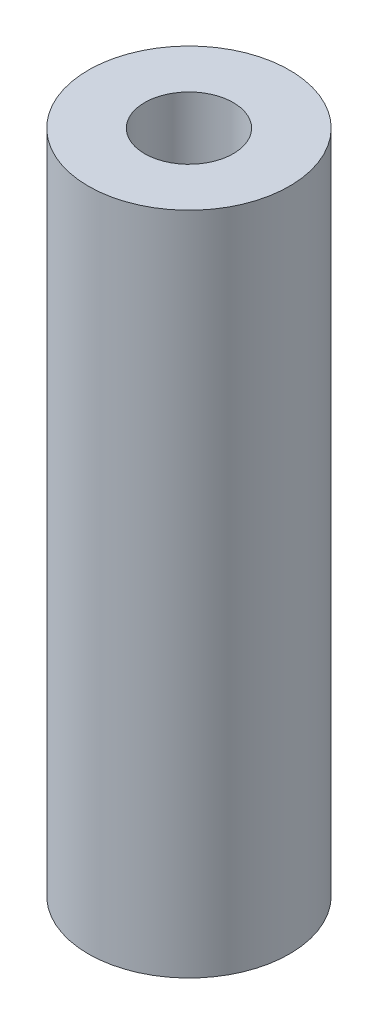
ISO-10303-21;
HEADER;
FILE_DESCRIPTION(('STEP AP214'),'2;1');
FILE_NAME('part.step','',(''),(''),'','','');
FILE_SCHEMA(('AUTOMOTIVE_DESIGN { 1 0 10303 214 1 1 1 1 }'));
ENDSEC;
DATA;
#1=APPLICATION_CONTEXT('core data for automotive mechanical design processes');
#2=APPLICATION_PROTOCOL_DEFINITION('international standard','automotive_design',2000,#1);
#3=PRODUCT_CONTEXT('',#1,'mechanical');
#4=PRODUCT('Part','Part','',(#3));
#5=PRODUCT_RELATED_PRODUCT_CATEGORY('part','',(#4));
#6=PRODUCT_DEFINITION_FORMATION('','',#4);
#7=PRODUCT_DEFINITION_CONTEXT('part definition',#1,'design');
#8=PRODUCT_DEFINITION('design','',#6,#7);
#9=PRODUCT_DEFINITION_SHAPE('','',#8);
#10=(LENGTH_UNIT() NAMED_UNIT(*) SI_UNIT(.MILLI.,.METRE.));
#11=(NAMED_UNIT(*) PLANE_ANGLE_UNIT() SI_UNIT($,.RADIAN.));
#12=(NAMED_UNIT(*) SI_UNIT($,.STERADIAN.) SOLID_ANGLE_UNIT());
#13=UNCERTAINTY_MEASURE_WITH_UNIT(LENGTH_MEASURE(1.E-05),#10,'distance_accuracy_value','');
#14=(GEOMETRIC_REPRESENTATION_CONTEXT(3) GLOBAL_UNCERTAINTY_ASSIGNED_CONTEXT((#13)) GLOBAL_UNIT_ASSIGNED_CONTEXT((#10,
#11,#12)) REPRESENTATION_CONTEXT('',''));
#15=CARTESIAN_POINT('',(0.,0.,0.));
#16=DIRECTION('',(0.,0.,1.));
#17=DIRECTION('',(1.,0.,0.));
#18=AXIS2_PLACEMENT_3D('',#15,#16,#17);
#19=CARTESIAN_POINT('',(0.,39.,0.));
#20=DIRECTION('',(0.,-1.,0.));
#21=DIRECTION('',(0.,0.,-1.));
#22=AXIS2_PLACEMENT_3D('',#19,#20,#21);
#23=CYLINDRICAL_SURFACE('',#22,5.9);
#24=CARTESIAN_POINT('',(0.,39.,0.));
#25=DIRECTION('',(0.,1.,0.));
#26=DIRECTION('',(0.,0.,1.));
#27=AXIS2_PLACEMENT_3D('',#24,#25,#26);
#28=CIRCLE('',#27,5.9);
#29=CARTESIAN_POINT('',(0.,39.,5.9));
#30=VERTEX_POINT('',#29);
#31=EDGE_CURVE('E10',#30,#30,#28,.T.);
#32=ORIENTED_EDGE('',*,*,#31,.F.);
#33=EDGE_LOOP('',(#32));
#34=FACE_BOUND('',#33,.T.);
#35=CARTESIAN_POINT('',(0.,0.,0.));
#36=DIRECTION('',(0.,1.,0.));
#37=DIRECTION('',(0.,0.,1.));
#38=AXIS2_PLACEMENT_3D('',#35,#36,#37);
#39=CIRCLE('',#38,5.9);
#40=CARTESIAN_POINT('',(0.,0.,5.9));
#41=VERTEX_POINT('',#40);
#42=EDGE_CURVE('E44',#41,#41,#39,.T.);
#43=ORIENTED_EDGE('',*,*,#42,.T.);
#44=EDGE_LOOP('',(#43));
#45=FACE_BOUND('',#44,.T.);
#46=ADVANCED_FACE('F41',(#34,#45),#23,.T.);
#47=CARTESIAN_POINT('',(0.,39.,0.));
#48=DIRECTION('',(0.,1.,0.));
#49=DIRECTION('',(0.,0.,1.));
#50=AXIS2_PLACEMENT_3D('',#47,#48,#49);
#51=PLANE('',#50);
#52=CARTESIAN_POINT('',(0.,39.,0.));
#53=DIRECTION('',(0.,1.,0.));
#54=DIRECTION('',(0.,0.,1.));
#55=AXIS2_PLACEMENT_3D('',#52,#53,#54);
#56=CIRCLE('',#55,2.6);
#57=CARTESIAN_POINT('',(0.,39.,2.6));
#58=VERTEX_POINT('',#57);
#59=EDGE_CURVE('E53',#58,#58,#56,.T.);
#60=ORIENTED_EDGE('',*,*,#59,.F.);
#61=EDGE_LOOP('',(#60));
#62=FACE_BOUND('',#61,.T.);
#63=ORIENTED_EDGE('',*,*,#31,.T.);
#64=EDGE_LOOP('',(#63));
#65=FACE_BOUND('',#64,.T.);
#66=ADVANCED_FACE('F68',(#62,#65),#51,.T.);
#67=CARTESIAN_POINT('',(0.,0.,0.));
#68=DIRECTION('',(0.,1.,0.));
#69=DIRECTION('',(0.,0.,1.));
#70=AXIS2_PLACEMENT_3D('',#67,#68,#69);
#71=PLANE('',#70);
#72=ORIENTED_EDGE('',*,*,#42,.F.);
#73=EDGE_LOOP('',(#72));
#74=FACE_BOUND('',#73,.T.);
#75=ADVANCED_FACE('F64',(#74),#71,.F.);
#76=CARTESIAN_POINT('',(0.,35.,0.));
#77=DIRECTION('',(0.,1.,0.));
#78=DIRECTION('',(0.,0.,1.));
#79=AXIS2_PLACEMENT_3D('',#76,#77,#78);
#80=CYLINDRICAL_SURFACE('',#79,2.6);
#81=CARTESIAN_POINT('',(0.,35.,0.));
#82=DIRECTION('',(0.,1.,0.));
#83=DIRECTION('',(0.,0.,1.));
#84=AXIS2_PLACEMENT_3D('',#81,#82,#83);
#85=CIRCLE('',#84,2.6);
#86=CARTESIAN_POINT('',(0.,35.,2.6));
#87=VERTEX_POINT('',#86);
#88=EDGE_CURVE('E51',#87,#87,#85,.T.);
#89=ORIENTED_EDGE('',*,*,#88,.F.);
#90=EDGE_LOOP('',(#89));
#91=FACE_BOUND('',#90,.T.);
#92=ORIENTED_EDGE('',*,*,#59,.T.);
#93=EDGE_LOOP('',(#92));
#94=FACE_BOUND('',#93,.T.);
#95=ADVANCED_FACE('F61',(#91,#94),#80,.F.);
#96=CARTESIAN_POINT('',(0.,35.,0.));
#97=DIRECTION('',(0.,1.,0.));
#98=DIRECTION('',(0.,0.,1.));
#99=AXIS2_PLACEMENT_3D('',#96,#97,#98);
#100=PLANE('',#99);
#101=ORIENTED_EDGE('',*,*,#88,.T.);
#102=EDGE_LOOP('',(#101));
#103=FACE_BOUND('',#102,.T.);
#104=ADVANCED_FACE('F59',(#103),#100,.T.);
#105=CLOSED_SHELL('',(#46,#66,#75,#95,#104));
#106=MANIFOLD_SOLID_BREP('B2',#105);
#107=ADVANCED_BREP_SHAPE_REPRESENTATION('',(#18,#106),#14);
#108=SHAPE_DEFINITION_REPRESENTATION(#9,#107);
ENDSEC;
END-ISO-10303-21;
